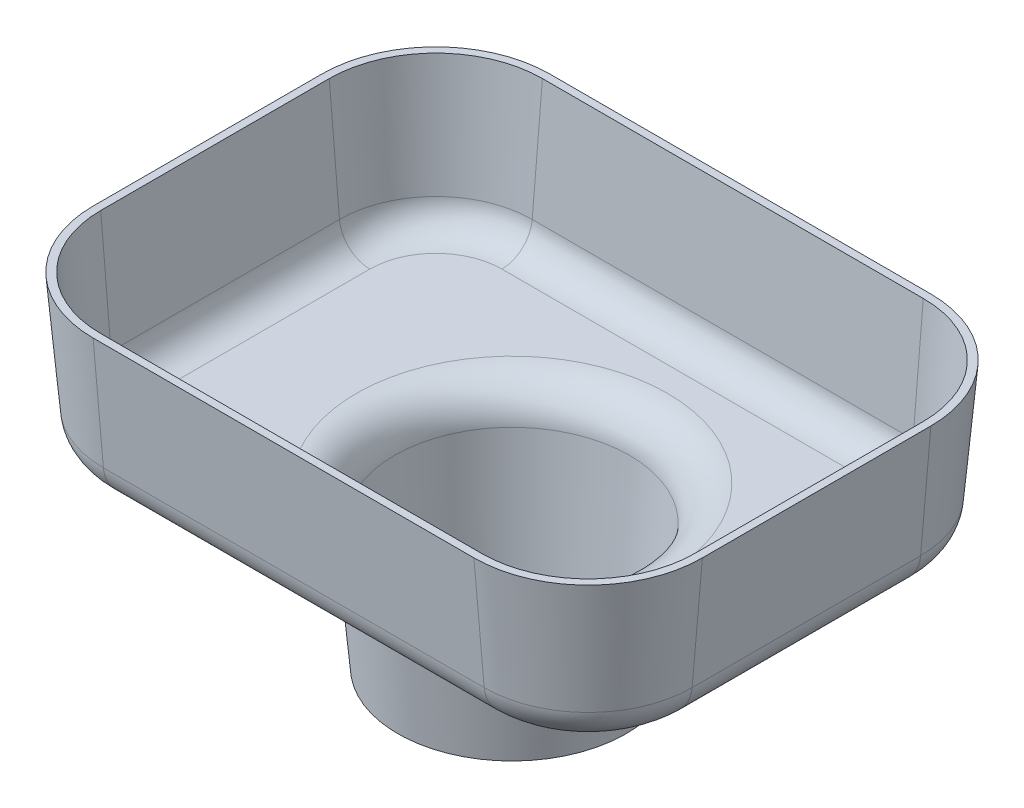
ISO-10303-21;
HEADER;
FILE_DESCRIPTION(('STEP AP214'),'2;1');
FILE_NAME('part.step','',(''),(''),'','','');
FILE_SCHEMA(('AUTOMOTIVE_DESIGN { 1 0 10303 214 1 1 1 1 }'));
ENDSEC;
DATA;
#1=APPLICATION_CONTEXT('core data for automotive mechanical design processes');
#2=APPLICATION_PROTOCOL_DEFINITION('international standard','automotive_design',2000,#1);
#3=PRODUCT_CONTEXT('',#1,'mechanical');
#4=PRODUCT('Part','Part','',(#3));
#5=PRODUCT_RELATED_PRODUCT_CATEGORY('part','',(#4));
#6=PRODUCT_DEFINITION_FORMATION('','',#4);
#7=PRODUCT_DEFINITION_CONTEXT('part definition',#1,'design');
#8=PRODUCT_DEFINITION('design','',#6,#7);
#9=PRODUCT_DEFINITION_SHAPE('','',#8);
#10=(LENGTH_UNIT() NAMED_UNIT(*) SI_UNIT(.MILLI.,.METRE.));
#11=(NAMED_UNIT(*) PLANE_ANGLE_UNIT() SI_UNIT($,.RADIAN.));
#12=(NAMED_UNIT(*) SI_UNIT($,.STERADIAN.) SOLID_ANGLE_UNIT());
#13=UNCERTAINTY_MEASURE_WITH_UNIT(LENGTH_MEASURE(1.E-05),#10,'distance_accuracy_value','');
#14=(GEOMETRIC_REPRESENTATION_CONTEXT(3) GLOBAL_UNCERTAINTY_ASSIGNED_CONTEXT((#13)) GLOBAL_UNIT_ASSIGNED_CONTEXT((#10,
#11,#12)) REPRESENTATION_CONTEXT('',''));
#15=CARTESIAN_POINT('',(0.,0.,0.));
#16=DIRECTION('',(0.,0.,1.));
#17=DIRECTION('',(1.,0.,0.));
#18=AXIS2_PLACEMENT_3D('',#15,#16,#17);
#19=CARTESIAN_POINT('',(-31.75,0.,-19.05));
#20=DIRECTION('',(0.,-1.,0.));
#21=DIRECTION('',(0.,0.,-1.));
#22=AXIS2_PLACEMENT_3D('',#19,#20,#21);
#23=PLANE('',#22);
#24=CARTESIAN_POINT('',(-31.75,0.,-19.05));
#25=DIRECTION('',(0.,1.,0.));
#26=DIRECTION('',(0.,0.,-1.));
#27=AXIS2_PLACEMENT_3D('',#24,#25,#26);
#28=CIRCLE('',#27,19.05);
#29=CARTESIAN_POINT('',(-31.7499999999999,0.,-38.1));
#30=VERTEX_POINT('',#29);
#31=CARTESIAN_POINT('',(-50.8,0.,-19.0499999999999));
#32=VERTEX_POINT('',#31);
#33=EDGE_CURVE('E341',#30,#32,#28,.T.);
#34=ORIENTED_EDGE('',*,*,#33,.T.);
#35=DIRECTION('',(0.,0.,1.));
#36=VECTOR('',#35,1.);
#37=CARTESIAN_POINT('',(-50.8,0.,19.0499999999999));
#38=LINE('',#37,#36);
#39=CARTESIAN_POINT('',(-50.8,0.,19.0499999999999));
#40=VERTEX_POINT('',#39);
#41=EDGE_CURVE('E345',#32,#40,#38,.T.);
#42=ORIENTED_EDGE('',*,*,#41,.T.);
#43=CARTESIAN_POINT('',(-31.75,0.,19.05));
#44=DIRECTION('',(0.,1.,0.));
#45=DIRECTION('',(0.,0.,1.));
#46=AXIS2_PLACEMENT_3D('',#43,#44,#45);
#47=CIRCLE('',#46,19.05);
#48=CARTESIAN_POINT('',(-31.75,0.,38.1));
#49=VERTEX_POINT('',#48);
#50=EDGE_CURVE('E349',#40,#49,#47,.T.);
#51=ORIENTED_EDGE('',*,*,#50,.T.);
#52=DIRECTION('',(1.,0.,0.));
#53=VECTOR('',#52,1.);
#54=CARTESIAN_POINT('',(31.7499999999999,0.,38.1));
#55=LINE('',#54,#53);
#56=CARTESIAN_POINT('',(31.7499999999999,0.,38.1));
#57=VERTEX_POINT('',#56);
#58=EDGE_CURVE('E353',#49,#57,#55,.T.);
#59=ORIENTED_EDGE('',*,*,#58,.T.);
#60=CARTESIAN_POINT('',(31.75,0.,19.05));
#61=DIRECTION('',(0.,1.,0.));
#62=DIRECTION('',(0.,0.,1.));
#63=AXIS2_PLACEMENT_3D('',#60,#61,#62);
#64=CIRCLE('',#63,19.05);
#65=CARTESIAN_POINT('',(50.8,0.,19.0499999999999));
#66=VERTEX_POINT('',#65);
#67=EDGE_CURVE('E357',#57,#66,#64,.T.);
#68=ORIENTED_EDGE('',*,*,#67,.T.);
#69=DIRECTION('',(0.,0.,-1.));
#70=VECTOR('',#69,1.);
#71=CARTESIAN_POINT('',(50.8,0.,19.0499999999999));
#72=LINE('',#71,#70);
#73=CARTESIAN_POINT('',(50.8,0.,-19.0499999999999));
#74=VERTEX_POINT('',#73);
#75=EDGE_CURVE('E361',#66,#74,#72,.T.);
#76=ORIENTED_EDGE('',*,*,#75,.T.);
#77=CARTESIAN_POINT('',(31.75,0.,-19.05));
#78=DIRECTION('',(0.,1.,0.));
#79=DIRECTION('',(0.,0.,1.));
#80=AXIS2_PLACEMENT_3D('',#77,#78,#79);
#81=CIRCLE('',#80,19.05);
#82=CARTESIAN_POINT('',(31.7499999999999,0.,-38.1));
#83=VERTEX_POINT('',#82);
#84=EDGE_CURVE('E365',#74,#83,#81,.T.);
#85=ORIENTED_EDGE('',*,*,#84,.T.);
#86=DIRECTION('',(-1.,0.,0.));
#87=VECTOR('',#86,1.);
#88=CARTESIAN_POINT('',(31.7499999999999,0.,-38.1));
#89=LINE('',#88,#87);
#90=EDGE_CURVE('E369',#83,#30,#89,.T.);
#91=ORIENTED_EDGE('',*,*,#90,.T.);
#92=EDGE_LOOP('',(#34,#42,#51,#59,#68,#76,#85,#91));
#93=FACE_BOUND('',#92,.T.);
#94=CARTESIAN_POINT('',(-31.75,0.,-19.05));
#95=DIRECTION('',(0.,-1.,0.));
#96=DIRECTION('',(0.,0.,-1.));
#97=AXIS2_PLACEMENT_3D('',#94,#95,#96);
#98=CIRCLE('',#97,17.77514880632);
#99=CARTESIAN_POINT('',(-31.7499999999999,0.,-36.8251488063199));
#100=VERTEX_POINT('',#99);
#101=CARTESIAN_POINT('',(-49.5251488063199,0.,-19.0499999999999));
#102=VERTEX_POINT('',#101);
#103=EDGE_CURVE('E226',#100,#102,#98,.F.);
#104=ORIENTED_EDGE('',*,*,#103,.F.);
#105=DIRECTION('',(-1.,0.,0.));
#106=VECTOR('',#105,1.);
#107=CARTESIAN_POINT('',(31.7499999999999,0.,-36.82514880632));
#108=LINE('',#107,#106);
#109=CARTESIAN_POINT('',(31.7499999999999,0.,-36.82514880632));
#110=VERTEX_POINT('',#109);
#111=EDGE_CURVE('E232',#110,#100,#108,.T.);
#112=ORIENTED_EDGE('',*,*,#111,.F.);
#113=CARTESIAN_POINT('',(31.75,0.,-19.05));
#114=DIRECTION('',(0.,-1.,0.));
#115=DIRECTION('',(0.,0.,-1.));
#116=AXIS2_PLACEMENT_3D('',#113,#114,#115);
#117=CIRCLE('',#116,17.77514880632);
#118=CARTESIAN_POINT('',(49.5251488063199,0.,-19.0499999999999));
#119=VERTEX_POINT('',#118);
#120=EDGE_CURVE('E61',#119,#110,#117,.F.);
#121=ORIENTED_EDGE('',*,*,#120,.F.);
#122=DIRECTION('',(0.,0.,-1.));
#123=VECTOR('',#122,1.);
#124=CARTESIAN_POINT('',(49.5251488063199,0.,19.0499999999999));
#125=LINE('',#124,#123);
#126=CARTESIAN_POINT('',(49.5251488063199,0.,19.0499999999999));
#127=VERTEX_POINT('',#126);
#128=EDGE_CURVE('E325',#127,#119,#125,.T.);
#129=ORIENTED_EDGE('',*,*,#128,.F.);
#130=CARTESIAN_POINT('',(31.75,0.,19.05));
#131=DIRECTION('',(0.,-1.,0.));
#132=DIRECTION('',(0.,0.,-1.));
#133=AXIS2_PLACEMENT_3D('',#130,#131,#132);
#134=CIRCLE('',#133,17.77514880632);
#135=CARTESIAN_POINT('',(31.7499999999999,0.,36.82514880632));
#136=VERTEX_POINT('',#135);
#137=EDGE_CURVE('E321',#136,#127,#134,.F.);
#138=ORIENTED_EDGE('',*,*,#137,.F.);
#139=DIRECTION('',(1.,0.,0.));
#140=VECTOR('',#139,1.);
#141=CARTESIAN_POINT('',(31.7499999999999,0.,36.82514880632));
#142=LINE('',#141,#140);
#143=CARTESIAN_POINT('',(-31.75,0.,36.82514880632));
#144=VERTEX_POINT('',#143);
#145=EDGE_CURVE('E317',#144,#136,#142,.T.);
#146=ORIENTED_EDGE('',*,*,#145,.F.);
#147=CARTESIAN_POINT('',(-31.75,0.,19.05));
#148=DIRECTION('',(0.,-1.,0.));
#149=DIRECTION('',(0.,0.,-1.));
#150=AXIS2_PLACEMENT_3D('',#147,#148,#149);
#151=CIRCLE('',#150,17.77514880632);
#152=CARTESIAN_POINT('',(-49.5251488063199,0.,19.0499999999999));
#153=VERTEX_POINT('',#152);
#154=EDGE_CURVE('E313',#153,#144,#151,.F.);
#155=ORIENTED_EDGE('',*,*,#154,.F.);
#156=DIRECTION('',(0.,0.,1.));
#157=VECTOR('',#156,1.);
#158=CARTESIAN_POINT('',(-49.5251488063199,0.,19.0499999999999));
#159=LINE('',#158,#157);
#160=EDGE_CURVE('E310',#102,#153,#159,.T.);
#161=ORIENTED_EDGE('',*,*,#160,.F.);
#162=EDGE_LOOP('',(#104,#112,#121,#129,#138,#146,#155,#161));
#163=FACE_BOUND('',#162,.T.);
#164=ADVANCED_FACE('F43',(#93,#163),#23,.F.);
#165=CARTESIAN_POINT('',(-31.75,0.,-19.05));
#166=DIRECTION('',(0.,1.,0.));
#167=DIRECTION('',(0.,0.,-1.));
#168=AXIS2_PLACEMENT_3D('',#165,#166,#167);
#169=CONICAL_SURFACE('',#168,19.05,0.0872664625997167);
#170=DIRECTION('',(0.,0.996194698091745,-0.0871557427476584));
#171=VECTOR('',#170,1.);
#172=CARTESIAN_POINT('',(-31.7499999999999,0.,-38.1));
#173=LINE('',#172,#171);
#174=CARTESIAN_POINT('',(-31.7499999999999,-19.6034389664476,-36.3849213243135));
#175=VERTEX_POINT('',#174);
#176=EDGE_CURVE('E374',#175,#30,#173,.T.);
#177=ORIENTED_EDGE('',*,*,#176,.F.);
#178=CARTESIAN_POINT('',(-31.75,-19.6034389664476,-19.05));
#179=DIRECTION('',(0.,-1.,0.));
#180=DIRECTION('',(0.,0.,-1.));
#181=AXIS2_PLACEMENT_3D('',#178,#179,#180);
#182=CIRCLE('',#181,17.3349213243135);
#183=CARTESIAN_POINT('',(-49.0849213243135,-19.6034389664476,-19.0499999999999));
#184=VERTEX_POINT('',#183);
#185=EDGE_CURVE('E446',#175,#184,#182,.F.);
#186=ORIENTED_EDGE('',*,*,#185,.T.);
#187=DIRECTION('',(-0.0871557427476584,0.996194698091745,0.));
#188=VECTOR('',#187,1.);
#189=CARTESIAN_POINT('',(-50.8,0.,-19.0499999999999));
#190=LINE('',#189,#188);
#191=EDGE_CURVE('E373',#184,#32,#190,.T.);
#192=ORIENTED_EDGE('',*,*,#191,.T.);
#193=ORIENTED_EDGE('',*,*,#33,.F.);
#194=EDGE_LOOP('',(#177,#186,#192,#193));
#195=FACE_BOUND('',#194,.T.);
#196=ADVANCED_FACE('F532',(#195),#169,.T.);
#197=CARTESIAN_POINT('',(31.7499999999999,0.,-38.1));
#198=DIRECTION('',(0.,-0.0871557427476584,-0.996194698091746));
#199=DIRECTION('',(0.,0.996194698091746,-0.0871557427476584));
#200=AXIS2_PLACEMENT_3D('',#197,#198,#199);
#201=PLANE('',#200);
#202=DIRECTION('',(0.,0.996194698091745,-0.0871557427476584));
#203=VECTOR('',#202,1.);
#204=CARTESIAN_POINT('',(31.7499999999999,0.,-38.1));
#205=LINE('',#204,#203);
#206=CARTESIAN_POINT('',(31.7499999999999,-19.6034389664476,-36.3849213243135));
#207=VERTEX_POINT('',#206);
#208=EDGE_CURVE('E378',#207,#83,#205,.T.);
#209=ORIENTED_EDGE('',*,*,#208,.F.);
#210=DIRECTION('',(-1.,0.,0.));
#211=VECTOR('',#210,1.);
#212=CARTESIAN_POINT('',(31.7499999999999,-19.6034389664476,-36.3849213243135));
#213=LINE('',#212,#211);
#214=EDGE_CURVE('E53',#207,#175,#213,.T.);
#215=ORIENTED_EDGE('',*,*,#214,.T.);
#216=ORIENTED_EDGE('',*,*,#176,.T.);
#217=ORIENTED_EDGE('',*,*,#90,.F.);
#218=EDGE_LOOP('',(#209,#215,#216,#217));
#219=FACE_BOUND('',#218,.T.);
#220=ADVANCED_FACE('F559',(#219),#201,.T.);
#221=CARTESIAN_POINT('',(31.75,0.,-19.05));
#222=DIRECTION('',(0.,1.,0.));
#223=DIRECTION('',(0.,0.,1.));
#224=AXIS2_PLACEMENT_3D('',#221,#222,#223);
#225=CONICAL_SURFACE('',#224,19.05,0.0872664625997167);
#226=DIRECTION('',(0.0871557427476584,0.996194698091745,0.));
#227=VECTOR('',#226,1.);
#228=CARTESIAN_POINT('',(50.8,0.,-19.0499999999999));
#229=LINE('',#228,#227);
#230=CARTESIAN_POINT('',(49.0849213243135,-19.6034389664476,-19.0499999999999));
#231=VERTEX_POINT('',#230);
#232=EDGE_CURVE('E393',#231,#74,#229,.T.);
#233=ORIENTED_EDGE('',*,*,#232,.F.);
#234=CARTESIAN_POINT('',(31.75,-19.6034389664476,-19.05));
#235=DIRECTION('',(0.,-1.,0.));
#236=DIRECTION('',(0.,0.,-1.));
#237=AXIS2_PLACEMENT_3D('',#234,#235,#236);
#238=CIRCLE('',#237,17.3349213243135);
#239=EDGE_CURVE('E11',#231,#207,#238,.F.);
#240=ORIENTED_EDGE('',*,*,#239,.T.);
#241=ORIENTED_EDGE('',*,*,#208,.T.);
#242=ORIENTED_EDGE('',*,*,#84,.F.);
#243=EDGE_LOOP('',(#233,#240,#241,#242));
#244=FACE_BOUND('',#243,.T.);
#245=ADVANCED_FACE('F574',(#244),#225,.T.);
#246=CARTESIAN_POINT('',(50.8,0.,19.0499999999999));
#247=DIRECTION('',(0.996194698091746,-0.0871557427476584,0.));
#248=DIRECTION('',(0.0871557427476584,0.996194698091746,0.));
#249=AXIS2_PLACEMENT_3D('',#246,#247,#248);
#250=PLANE('',#249);
#251=DIRECTION('',(0.0871557427476584,0.996194698091745,0.));
#252=VECTOR('',#251,1.);
#253=CARTESIAN_POINT('',(50.8,0.,19.0499999999999));
#254=LINE('',#253,#252);
#255=CARTESIAN_POINT('',(49.0849213243135,-19.6034389664476,19.0499999999999));
#256=VERTEX_POINT('',#255);
#257=EDGE_CURVE('E390',#256,#66,#254,.T.);
#258=ORIENTED_EDGE('',*,*,#257,.F.);
#259=DIRECTION('',(0.,0.,-1.));
#260=VECTOR('',#259,1.);
#261=CARTESIAN_POINT('',(49.0849213243135,-19.6034389664476,19.0499999999999));
#262=LINE('',#261,#260);
#263=EDGE_CURVE('E405',#256,#231,#262,.T.);
#264=ORIENTED_EDGE('',*,*,#263,.T.);
#265=ORIENTED_EDGE('',*,*,#232,.T.);
#266=ORIENTED_EDGE('',*,*,#75,.F.);
#267=EDGE_LOOP('',(#258,#264,#265,#266));
#268=FACE_BOUND('',#267,.T.);
#269=ADVANCED_FACE('F513',(#268),#250,.T.);
#270=CARTESIAN_POINT('',(31.75,0.,19.05));
#271=DIRECTION('',(0.,1.,0.));
#272=DIRECTION('',(0.,0.,1.));
#273=AXIS2_PLACEMENT_3D('',#270,#271,#272);
#274=CONICAL_SURFACE('',#273,19.05,0.0872664625997167);
#275=DIRECTION('',(0.,0.996194698091745,0.0871557427476584));
#276=VECTOR('',#275,1.);
#277=CARTESIAN_POINT('',(31.7499999999999,0.,38.1));
#278=LINE('',#277,#276);
#279=CARTESIAN_POINT('',(31.7499999999999,-19.6034389664476,36.3849213243135));
#280=VERTEX_POINT('',#279);
#281=EDGE_CURVE('E387',#280,#57,#278,.T.);
#282=ORIENTED_EDGE('',*,*,#281,.F.);
#283=CARTESIAN_POINT('',(31.75,-19.6034389664476,19.05));
#284=DIRECTION('',(0.,-1.,0.));
#285=DIRECTION('',(0.,0.,-1.));
#286=AXIS2_PLACEMENT_3D('',#283,#284,#285);
#287=CIRCLE('',#286,17.3349213243135);
#288=EDGE_CURVE('E434',#280,#256,#287,.F.);
#289=ORIENTED_EDGE('',*,*,#288,.T.);
#290=ORIENTED_EDGE('',*,*,#257,.T.);
#291=ORIENTED_EDGE('',*,*,#67,.F.);
#292=EDGE_LOOP('',(#282,#289,#290,#291));
#293=FACE_BOUND('',#292,.T.);
#294=ADVANCED_FACE('F509',(#293),#274,.T.);
#295=CARTESIAN_POINT('',(31.7499999999999,0.,38.1));
#296=DIRECTION('',(0.,-0.0871557427476584,0.996194698091746));
#297=DIRECTION('',(0.,-0.996194698091746,-0.0871557427476584));
#298=AXIS2_PLACEMENT_3D('',#295,#296,#297);
#299=PLANE('',#298);
#300=DIRECTION('',(0.,0.996194698091745,0.0871557427476584));
#301=VECTOR('',#300,1.);
#302=CARTESIAN_POINT('',(-31.75,0.,38.1));
#303=LINE('',#302,#301);
#304=CARTESIAN_POINT('',(-31.75,-19.6034389664476,36.3849213243135));
#305=VERTEX_POINT('',#304);
#306=EDGE_CURVE('E384',#305,#49,#303,.T.);
#307=ORIENTED_EDGE('',*,*,#306,.F.);
#308=DIRECTION('',(1.,0.,0.));
#309=VECTOR('',#308,1.);
#310=CARTESIAN_POINT('',(31.7499999999999,-19.6034389664476,36.3849213243135));
#311=LINE('',#310,#309);
#312=EDGE_CURVE('E437',#305,#280,#311,.T.);
#313=ORIENTED_EDGE('',*,*,#312,.T.);
#314=ORIENTED_EDGE('',*,*,#281,.T.);
#315=ORIENTED_EDGE('',*,*,#58,.F.);
#316=EDGE_LOOP('',(#307,#313,#314,#315));
#317=FACE_BOUND('',#316,.T.);
#318=ADVANCED_FACE('F521',(#317),#299,.T.);
#319=CARTESIAN_POINT('',(-31.75,0.,19.05));
#320=DIRECTION('',(0.,1.,0.));
#321=DIRECTION('',(0.,0.,1.));
#322=AXIS2_PLACEMENT_3D('',#319,#320,#321);
#323=CONICAL_SURFACE('',#322,19.05,0.0872664625997167);
#324=DIRECTION('',(-0.0871557427476584,0.996194698091745,0.));
#325=VECTOR('',#324,1.);
#326=CARTESIAN_POINT('',(-50.8,0.,19.0499999999999));
#327=LINE('',#326,#325);
#328=CARTESIAN_POINT('',(-49.0849213243135,-19.6034389664476,19.0499999999999));
#329=VERTEX_POINT('',#328);
#330=EDGE_CURVE('E381',#329,#40,#327,.T.);
#331=ORIENTED_EDGE('',*,*,#330,.F.);
#332=CARTESIAN_POINT('',(-31.75,-19.6034389664476,19.05));
#333=DIRECTION('',(0.,-1.,0.));
#334=DIRECTION('',(0.,0.,-1.));
#335=AXIS2_PLACEMENT_3D('',#332,#333,#334);
#336=CIRCLE('',#335,17.3349213243135);
#337=EDGE_CURVE('E440',#329,#305,#336,.F.);
#338=ORIENTED_EDGE('',*,*,#337,.T.);
#339=ORIENTED_EDGE('',*,*,#306,.T.);
#340=ORIENTED_EDGE('',*,*,#50,.F.);
#341=EDGE_LOOP('',(#331,#338,#339,#340));
#342=FACE_BOUND('',#341,.T.);
#343=ADVANCED_FACE('F524',(#342),#323,.T.);
#344=CARTESIAN_POINT('',(-50.8,0.,19.0499999999999));
#345=DIRECTION('',(-0.996194698091746,-0.0871557427476584,0.));
#346=DIRECTION('',(0.0871557427476584,-0.996194698091746,0.));
#347=AXIS2_PLACEMENT_3D('',#344,#345,#346);
#348=PLANE('',#347);
#349=ORIENTED_EDGE('',*,*,#191,.F.);
#350=DIRECTION('',(0.,0.,1.));
#351=VECTOR('',#350,1.);
#352=CARTESIAN_POINT('',(-49.0849213243135,-19.6034389664476,19.0499999999999));
#353=LINE('',#352,#351);
#354=EDGE_CURVE('E443',#184,#329,#353,.T.);
#355=ORIENTED_EDGE('',*,*,#354,.T.);
#356=ORIENTED_EDGE('',*,*,#330,.T.);
#357=ORIENTED_EDGE('',*,*,#41,.F.);
#358=EDGE_LOOP('',(#349,#355,#356,#357));
#359=FACE_BOUND('',#358,.T.);
#360=ADVANCED_FACE('F528',(#359),#348,.T.);
#361=CARTESIAN_POINT('',(-31.75,-25.4,-19.05));
#362=DIRECTION('',(0.,-1.,0.));
#363=DIRECTION('',(0.,0.,-1.));
#364=AXIS2_PLACEMENT_3D('',#361,#362,#363);
#365=PLANE('',#364);
#366=CARTESIAN_POINT('',(31.75,-25.4,-19.05));
#367=DIRECTION('',(0.,-1.,0.));
#368=DIRECTION('',(0.,0.,-1.));
#369=AXIS2_PLACEMENT_3D('',#366,#367,#368);
#370=CIRCLE('',#369,11.0090849914309);
#371=CARTESIAN_POINT('',(31.7499999999999,-25.4,-30.0590849914309));
#372=VERTEX_POINT('',#371);
#373=CARTESIAN_POINT('',(42.7590849914309,-25.4,-19.0499999999999));
#374=VERTEX_POINT('',#373);
#375=EDGE_CURVE('E409',#372,#374,#370,.T.);
#376=ORIENTED_EDGE('',*,*,#375,.T.);
#377=DIRECTION('',(0.,0.,-1.));
#378=VECTOR('',#377,1.);
#379=CARTESIAN_POINT('',(42.7590849914309,-25.4,-19.05));
#380=LINE('',#379,#378);
#381=CARTESIAN_POINT('',(42.7590849914309,-25.4,19.0499999999999));
#382=VERTEX_POINT('',#381);
#383=EDGE_CURVE('E430',#374,#382,#380,.F.);
#384=ORIENTED_EDGE('',*,*,#383,.T.);
#385=CARTESIAN_POINT('',(31.75,-25.4,19.05));
#386=DIRECTION('',(0.,-1.,0.));
#387=DIRECTION('',(0.,0.,-1.));
#388=AXIS2_PLACEMENT_3D('',#385,#386,#387);
#389=CIRCLE('',#388,11.0090849914309);
#390=CARTESIAN_POINT('',(31.7499999999999,-25.4,30.0590849914309));
#391=VERTEX_POINT('',#390);
#392=EDGE_CURVE('E427',#382,#391,#389,.T.);
#393=ORIENTED_EDGE('',*,*,#392,.T.);
#394=DIRECTION('',(1.,0.,0.));
#395=VECTOR('',#394,1.);
#396=CARTESIAN_POINT('',(-31.75,-25.4,30.0590849914309));
#397=LINE('',#396,#395);
#398=CARTESIAN_POINT('',(-31.75,-25.4,30.0590849914309));
#399=VERTEX_POINT('',#398);
#400=EDGE_CURVE('E424',#391,#399,#397,.F.);
#401=ORIENTED_EDGE('',*,*,#400,.T.);
#402=CARTESIAN_POINT('',(-31.75,-25.4,19.05));
#403=DIRECTION('',(0.,-1.,0.));
#404=DIRECTION('',(0.,0.,-1.));
#405=AXIS2_PLACEMENT_3D('',#402,#403,#404);
#406=CIRCLE('',#405,11.0090849914309);
#407=CARTESIAN_POINT('',(-42.7590849914309,-25.4,19.0499999999999));
#408=VERTEX_POINT('',#407);
#409=EDGE_CURVE('E421',#399,#408,#406,.T.);
#410=ORIENTED_EDGE('',*,*,#409,.T.);
#411=DIRECTION('',(0.,0.,1.));
#412=VECTOR('',#411,1.);
#413=CARTESIAN_POINT('',(-42.7590849914309,-25.4,-19.05));
#414=LINE('',#413,#412);
#415=CARTESIAN_POINT('',(-42.7590849914309,-25.4,-19.0499999999999));
#416=VERTEX_POINT('',#415);
#417=EDGE_CURVE('E418',#408,#416,#414,.F.);
#418=ORIENTED_EDGE('',*,*,#417,.T.);
#419=CARTESIAN_POINT('',(-31.75,-25.4,-19.05));
#420=DIRECTION('',(0.,-1.,0.));
#421=DIRECTION('',(0.,0.,-1.));
#422=AXIS2_PLACEMENT_3D('',#419,#420,#421);
#423=CIRCLE('',#422,11.0090849914309);
#424=CARTESIAN_POINT('',(-31.7499999999999,-25.4,-30.0590849914309));
#425=VERTEX_POINT('',#424);
#426=EDGE_CURVE('E415',#416,#425,#423,.T.);
#427=ORIENTED_EDGE('',*,*,#426,.T.);
#428=DIRECTION('',(-1.,0.,0.));
#429=VECTOR('',#428,1.);
#430=CARTESIAN_POINT('',(-31.75,-25.4,-30.0590849914309));
#431=LINE('',#430,#429);
#432=EDGE_CURVE('E412',#425,#372,#431,.F.);
#433=ORIENTED_EDGE('',*,*,#432,.T.);
#434=EDGE_LOOP('',(#376,#384,#393,#401,#410,#418,#427,#433));
#435=FACE_BOUND('',#434,.T.);
#436=CARTESIAN_POINT('',(0.,-25.4,0.));
#437=DIRECTION('',(0.,-1.,0.));
#438=DIRECTION('',(0.,0.,-1.));
#439=AXIS2_PLACEMENT_3D('',#436,#437,#438);
#440=CIRCLE('',#439,25.927174417567);
#441=CARTESIAN_POINT('',(0.,-25.4,-25.927174417567));
#442=VERTEX_POINT('',#441);
#443=EDGE_CURVE('E377',#442,#442,#440,.F.);
#444=ORIENTED_EDGE('',*,*,#443,.T.);
#445=EDGE_LOOP('',(#444));
#446=FACE_BOUND('',#445,.T.);
#447=ADVANCED_FACE('F492',(#435,#446),#365,.T.);
#448=CARTESIAN_POINT('',(0.,-50.8,0.));
#449=DIRECTION('',(0.,1.,0.));
#450=DIRECTION('',(0.,0.,-1.));
#451=AXIS2_PLACEMENT_3D('',#448,#449,#450);
#452=CONICAL_SURFACE('',#451,19.05,0.0872664625997167);
#453=CARTESIAN_POINT('',(0.,-30.0372488268419,0.));
#454=DIRECTION('',(0.,1.,0.));
#455=DIRECTION('',(0.,0.,1.));
#456=AXIS2_PLACEMENT_3D('',#453,#454,#455);
#457=CIRCLE('',#456,20.8665053512609);
#458=CARTESIAN_POINT('',(0.,-30.0372488268419,20.8665053512609));
#459=VERTEX_POINT('',#458);
#460=EDGE_CURVE('E401',#459,#459,#457,.F.);
#461=ORIENTED_EDGE('',*,*,#460,.T.);
#462=EDGE_LOOP('',(#461));
#463=FACE_BOUND('',#462,.T.);
#464=CARTESIAN_POINT('',(0.,-50.8,0.));
#465=DIRECTION('',(0.,-1.,0.));
#466=DIRECTION('',(0.,0.,-1.));
#467=AXIS2_PLACEMENT_3D('',#464,#465,#466);
#468=CIRCLE('',#467,19.05);
#469=CARTESIAN_POINT('',(0.,-50.8,-19.05));
#470=VERTEX_POINT('',#469);
#471=EDGE_CURVE('E337',#470,#470,#468,.T.);
#472=ORIENTED_EDGE('',*,*,#471,.F.);
#473=EDGE_LOOP('',(#472));
#474=FACE_BOUND('',#473,.T.);
#475=ADVANCED_FACE('F588',(#463,#474),#452,.T.);
#476=CARTESIAN_POINT('',(0.,-50.8,0.));
#477=DIRECTION('',(0.,-1.,0.));
#478=DIRECTION('',(0.,0.,-1.));
#479=AXIS2_PLACEMENT_3D('',#476,#477,#478);
#480=PLANE('',#479);
#481=CARTESIAN_POINT('',(0.,-50.8,0.));
#482=DIRECTION('',(0.,-1.,0.));
#483=DIRECTION('',(0.,0.,-1.));
#484=AXIS2_PLACEMENT_3D('',#481,#482,#483);
#485=CIRCLE('',#484,17.77514880632);
#486=CARTESIAN_POINT('',(0.,-50.8,-17.77514880632));
#487=VERTEX_POINT('',#486);
#488=EDGE_CURVE('E251',#487,#487,#485,.T.);
#489=ORIENTED_EDGE('',*,*,#488,.F.);
#490=EDGE_LOOP('',(#489));
#491=FACE_BOUND('',#490,.T.);
#492=ORIENTED_EDGE('',*,*,#471,.T.);
#493=EDGE_LOOP('',(#492));
#494=FACE_BOUND('',#493,.T.);
#495=ADVANCED_FACE('F582',(#491,#494),#480,.T.);
#496=CARTESIAN_POINT('',(0.,-30.48,0.));
#497=DIRECTION('',(0.,-1.,0.));
#498=DIRECTION('',(0.,0.,-1.));
#499=AXIS2_PLACEMENT_3D('',#496,#497,#498);
#500=TOROIDAL_SURFACE('',#499,25.927174417567,5.08);
#501=ORIENTED_EDGE('',*,*,#460,.F.);
#502=EDGE_LOOP('',(#501));
#503=FACE_BOUND('',#502,.T.);
#504=ORIENTED_EDGE('',*,*,#443,.F.);
#505=EDGE_LOOP('',(#504));
#506=FACE_BOUND('',#505,.T.);
#507=ADVANCED_FACE('F580',(#503,#506),#500,.F.);
#508=CARTESIAN_POINT('',(-42.7590849914309,-19.05,19.0499999999999));
#509=DIRECTION('',(0.,0.,1.));
#510=DIRECTION('',(1.,0.,0.));
#511=AXIS2_PLACEMENT_3D('',#508,#509,#510);
#512=CYLINDRICAL_SURFACE('',#511,6.35);
#513=CARTESIAN_POINT('',(-42.7590849914309,-19.05,-19.0499999999999));
#514=DIRECTION('',(0.,0.,-1.));
#515=DIRECTION('',(-1.,0.,0.));
#516=AXIS2_PLACEMENT_3D('',#513,#514,#515);
#517=CIRCLE('',#516,6.35);
#518=EDGE_CURVE('E473',#416,#184,#517,.T.);
#519=ORIENTED_EDGE('',*,*,#518,.F.);
#520=ORIENTED_EDGE('',*,*,#417,.F.);
#521=CARTESIAN_POINT('',(-42.7590849914309,-19.05,19.0499999999999));
#522=DIRECTION('',(0.,0.,1.));
#523=DIRECTION('',(0.,-1.,0.));
#524=AXIS2_PLACEMENT_3D('',#521,#522,#523);
#525=CIRCLE('',#524,6.35);
#526=EDGE_CURVE('E47',#329,#408,#525,.T.);
#527=ORIENTED_EDGE('',*,*,#526,.F.);
#528=ORIENTED_EDGE('',*,*,#354,.F.);
#529=EDGE_LOOP('',(#519,#520,#527,#528));
#530=FACE_BOUND('',#529,.T.);
#531=ADVANCED_FACE('F45',(#530),#512,.T.);
#532=CARTESIAN_POINT('',(-31.75,-19.05,19.05));
#533=DIRECTION('',(0.,-1.,0.));
#534=DIRECTION('',(0.,0.,-1.));
#535=AXIS2_PLACEMENT_3D('',#532,#533,#534);
#536=TOROIDAL_SURFACE('',#535,11.0090849914309,6.35);
#537=ORIENTED_EDGE('',*,*,#526,.T.);
#538=ORIENTED_EDGE('',*,*,#409,.F.);
#539=CARTESIAN_POINT('',(-31.75,-19.05,30.0590849914309));
#540=DIRECTION('',(1.,0.,0.));
#541=DIRECTION('',(0.,0.,-1.));
#542=AXIS2_PLACEMENT_3D('',#539,#540,#541);
#543=CIRCLE('',#542,6.35);
#544=EDGE_CURVE('E470',#305,#399,#543,.T.);
#545=ORIENTED_EDGE('',*,*,#544,.F.);
#546=ORIENTED_EDGE('',*,*,#337,.F.);
#547=EDGE_LOOP('',(#537,#538,#545,#546));
#548=FACE_BOUND('',#547,.T.);
#549=ADVANCED_FACE('F486',(#548),#536,.T.);
#550=CARTESIAN_POINT('',(-31.75,-19.05,-19.05));
#551=DIRECTION('',(0.,-1.,0.));
#552=DIRECTION('',(0.,0.,-1.));
#553=AXIS2_PLACEMENT_3D('',#550,#551,#552);
#554=TOROIDAL_SURFACE('',#553,11.0090849914309,6.35);
#555=ORIENTED_EDGE('',*,*,#518,.T.);
#556=ORIENTED_EDGE('',*,*,#185,.F.);
#557=CARTESIAN_POINT('',(-31.7499999999999,-19.05,-30.0590849914309));
#558=DIRECTION('',(1.,0.,0.));
#559=DIRECTION('',(0.,0.,-1.));
#560=AXIS2_PLACEMENT_3D('',#557,#558,#559);
#561=CIRCLE('',#560,6.35);
#562=EDGE_CURVE('E466',#425,#175,#561,.T.);
#563=ORIENTED_EDGE('',*,*,#562,.F.);
#564=ORIENTED_EDGE('',*,*,#426,.F.);
#565=EDGE_LOOP('',(#555,#556,#563,#564));
#566=FACE_BOUND('',#565,.T.);
#567=ADVANCED_FACE('F533',(#566),#554,.T.);
#568=CARTESIAN_POINT('',(31.7499999999999,-19.05,30.0590849914309));
#569=DIRECTION('',(1.,0.,0.));
#570=DIRECTION('',(0.,0.,-1.));
#571=AXIS2_PLACEMENT_3D('',#568,#569,#570);
#572=CYLINDRICAL_SURFACE('',#571,6.35);
#573=ORIENTED_EDGE('',*,*,#544,.T.);
#574=ORIENTED_EDGE('',*,*,#400,.F.);
#575=CARTESIAN_POINT('',(31.7499999999999,-19.05,30.0590849914309));
#576=DIRECTION('',(1.,0.,0.));
#577=DIRECTION('',(0.,1.,0.));
#578=AXIS2_PLACEMENT_3D('',#575,#576,#577);
#579=CIRCLE('',#578,6.35);
#580=EDGE_CURVE('E462',#280,#391,#579,.T.);
#581=ORIENTED_EDGE('',*,*,#580,.F.);
#582=ORIENTED_EDGE('',*,*,#312,.F.);
#583=EDGE_LOOP('',(#573,#574,#581,#582));
#584=FACE_BOUND('',#583,.T.);
#585=ADVANCED_FACE('F499',(#584),#572,.T.);
#586=CARTESIAN_POINT('',(31.7499999999999,-19.05,-30.0590849914309));
#587=DIRECTION('',(-1.,0.,0.));
#588=DIRECTION('',(0.,0.,1.));
#589=AXIS2_PLACEMENT_3D('',#586,#587,#588);
#590=CYLINDRICAL_SURFACE('',#589,6.35);
#591=ORIENTED_EDGE('',*,*,#562,.T.);
#592=ORIENTED_EDGE('',*,*,#214,.F.);
#593=CARTESIAN_POINT('',(31.7499999999999,-19.05,-30.0590849914309));
#594=DIRECTION('',(1.,0.,0.));
#595=DIRECTION('',(0.,0.,-1.));
#596=AXIS2_PLACEMENT_3D('',#593,#594,#595);
#597=CIRCLE('',#596,6.35);
#598=EDGE_CURVE('E458',#372,#207,#597,.T.);
#599=ORIENTED_EDGE('',*,*,#598,.F.);
#600=ORIENTED_EDGE('',*,*,#432,.F.);
#601=EDGE_LOOP('',(#591,#592,#599,#600));
#602=FACE_BOUND('',#601,.T.);
#603=ADVANCED_FACE('F537',(#602),#590,.T.);
#604=CARTESIAN_POINT('',(31.75,-19.05,19.05));
#605=DIRECTION('',(0.,-1.,0.));
#606=DIRECTION('',(0.,0.,-1.));
#607=AXIS2_PLACEMENT_3D('',#604,#605,#606);
#608=TOROIDAL_SURFACE('',#607,11.0090849914309,6.35);
#609=ORIENTED_EDGE('',*,*,#580,.T.);
#610=ORIENTED_EDGE('',*,*,#392,.F.);
#611=CARTESIAN_POINT('',(42.7590849914309,-19.05,19.0499999999999));
#612=DIRECTION('',(0.,0.,-1.));
#613=DIRECTION('',(0.,1.,0.));
#614=AXIS2_PLACEMENT_3D('',#611,#612,#613);
#615=CIRCLE('',#614,6.35);
#616=EDGE_CURVE('E454',#256,#382,#615,.T.);
#617=ORIENTED_EDGE('',*,*,#616,.F.);
#618=ORIENTED_EDGE('',*,*,#288,.F.);
#619=EDGE_LOOP('',(#609,#610,#617,#618));
#620=FACE_BOUND('',#619,.T.);
#621=ADVANCED_FACE('F503',(#620),#608,.T.);
#622=CARTESIAN_POINT('',(31.75,-19.05,-19.05));
#623=DIRECTION('',(0.,-1.,0.));
#624=DIRECTION('',(0.,0.,-1.));
#625=AXIS2_PLACEMENT_3D('',#622,#623,#624);
#626=TOROIDAL_SURFACE('',#625,11.0090849914309,6.35);
#627=ORIENTED_EDGE('',*,*,#598,.T.);
#628=ORIENTED_EDGE('',*,*,#239,.F.);
#629=CARTESIAN_POINT('',(42.7590849914309,-19.05,-19.0499999999999));
#630=DIRECTION('',(0.,0.,1.));
#631=DIRECTION('',(1.,0.,0.));
#632=AXIS2_PLACEMENT_3D('',#629,#630,#631);
#633=CIRCLE('',#632,6.35);
#634=EDGE_CURVE('E451',#374,#231,#633,.T.);
#635=ORIENTED_EDGE('',*,*,#634,.F.);
#636=ORIENTED_EDGE('',*,*,#375,.F.);
#637=EDGE_LOOP('',(#627,#628,#635,#636));
#638=FACE_BOUND('',#637,.T.);
#639=ADVANCED_FACE('F545',(#638),#626,.T.);
#640=CARTESIAN_POINT('',(42.7590849914309,-19.05,19.0499999999999));
#641=DIRECTION('',(0.,0.,-1.));
#642=DIRECTION('',(-1.,0.,0.));
#643=AXIS2_PLACEMENT_3D('',#640,#641,#642);
#644=CYLINDRICAL_SURFACE('',#643,6.35);
#645=ORIENTED_EDGE('',*,*,#616,.T.);
#646=ORIENTED_EDGE('',*,*,#383,.F.);
#647=ORIENTED_EDGE('',*,*,#634,.T.);
#648=ORIENTED_EDGE('',*,*,#263,.F.);
#649=EDGE_LOOP('',(#645,#646,#647,#648));
#650=FACE_BOUND('',#649,.T.);
#651=ADVANCED_FACE('F544',(#650),#644,.T.);
#652=CARTESIAN_POINT('',(-31.75,0.110687793289526,-19.05));
#653=DIRECTION('',(0.,1.,0.));
#654=DIRECTION('',(0.,0.,-1.));
#655=AXIS2_PLACEMENT_3D('',#652,#653,#654);
#656=CONICAL_SURFACE('',#655,17.7848327334235,0.0872664625997167);
#657=DIRECTION('',(0.,0.996194698091746,-0.0871557427476584));
#658=VECTOR('',#657,1.);
#659=CARTESIAN_POINT('',(-31.7499999999999,0.110687793289527,-36.8348327334235));
#660=LINE('',#659,#658);
#661=CARTESIAN_POINT('',(-31.7499999999999,-19.4927511731581,-35.1197540577369));
#662=VERTEX_POINT('',#661);
#663=EDGE_CURVE('E288',#662,#100,#660,.T.);
#664=ORIENTED_EDGE('',*,*,#663,.T.);
#665=ORIENTED_EDGE('',*,*,#103,.T.);
#666=DIRECTION('',(-0.0871557427476584,0.996194698091746,0.));
#667=VECTOR('',#666,1.);
#668=CARTESIAN_POINT('',(-49.5348327334235,0.110687793289526,-19.0499999999999));
#669=LINE('',#668,#667);
#670=CARTESIAN_POINT('',(-47.819754057737,-19.4927511731581,-19.0499999999999));
#671=VERTEX_POINT('',#670);
#672=EDGE_CURVE('E222',#671,#102,#669,.T.);
#673=ORIENTED_EDGE('',*,*,#672,.F.);
#674=CARTESIAN_POINT('',(-31.75,-19.4927511731581,-19.05));
#675=DIRECTION('',(0.,1.,0.));
#676=DIRECTION('',(0.,0.,1.));
#677=AXIS2_PLACEMENT_3D('',#674,#675,#676);
#678=CIRCLE('',#677,16.069754057737);
#679=EDGE_CURVE('E208',#662,#671,#678,.T.);
#680=ORIENTED_EDGE('',*,*,#679,.F.);
#681=EDGE_LOOP('',(#664,#665,#673,#680));
#682=FACE_BOUND('',#681,.T.);
#683=ADVANCED_FACE('F224',(#682),#656,.F.);
#684=CARTESIAN_POINT('',(31.7499999999999,0.110687793289526,-36.8348327334235));
#685=DIRECTION('',(0.,-0.0871557427476584,-0.996194698091746));
#686=DIRECTION('',(0.,0.996194698091746,-0.0871557427476584));
#687=AXIS2_PLACEMENT_3D('',#684,#685,#686);
#688=PLANE('',#687);
#689=DIRECTION('',(0.,0.996194698091746,-0.0871557427476584));
#690=VECTOR('',#689,1.);
#691=CARTESIAN_POINT('',(31.7499999999999,0.110687793289526,-36.8348327334235));
#692=LINE('',#691,#690);
#693=CARTESIAN_POINT('',(31.7499999999999,-19.4927511731581,-35.119754057737));
#694=VERTEX_POINT('',#693);
#695=EDGE_CURVE('E987',#694,#110,#692,.T.);
#696=ORIENTED_EDGE('',*,*,#695,.T.);
#697=ORIENTED_EDGE('',*,*,#111,.T.);
#698=ORIENTED_EDGE('',*,*,#663,.F.);
#699=DIRECTION('',(1.,0.,0.));
#700=VECTOR('',#699,1.);
#701=CARTESIAN_POINT('',(31.7499999999999,-19.4927511731581,-35.119754057737));
#702=LINE('',#701,#700);
#703=EDGE_CURVE('E218',#694,#662,#702,.F.);
#704=ORIENTED_EDGE('',*,*,#703,.F.);
#705=EDGE_LOOP('',(#696,#697,#698,#704));
#706=FACE_BOUND('',#705,.T.);
#707=ADVANCED_FACE('F664',(#706),#688,.F.);
#708=CARTESIAN_POINT('',(31.75,0.110687793289526,-19.05));
#709=DIRECTION('',(0.,1.,0.));
#710=DIRECTION('',(0.,0.,1.));
#711=AXIS2_PLACEMENT_3D('',#708,#709,#710);
#712=CONICAL_SURFACE('',#711,17.7848327334235,0.0872664625997167);
#713=DIRECTION('',(0.0871557427476584,0.996194698091746,0.));
#714=VECTOR('',#713,1.);
#715=CARTESIAN_POINT('',(49.5348327334235,0.110687793289526,-19.0499999999999));
#716=LINE('',#715,#714);
#717=CARTESIAN_POINT('',(47.819754057737,-19.4927511731581,-19.0499999999999));
#718=VERTEX_POINT('',#717);
#719=EDGE_CURVE('E992',#718,#119,#716,.T.);
#720=ORIENTED_EDGE('',*,*,#719,.T.);
#721=ORIENTED_EDGE('',*,*,#120,.T.);
#722=ORIENTED_EDGE('',*,*,#695,.F.);
#723=CARTESIAN_POINT('',(31.75,-19.4927511731581,-19.05));
#724=DIRECTION('',(0.,1.,0.));
#725=DIRECTION('',(0.,0.,1.));
#726=AXIS2_PLACEMENT_3D('',#723,#724,#725);
#727=CIRCLE('',#726,16.069754057737);
#728=EDGE_CURVE('E455',#718,#694,#727,.T.);
#729=ORIENTED_EDGE('',*,*,#728,.F.);
#730=EDGE_LOOP('',(#720,#721,#722,#729));
#731=FACE_BOUND('',#730,.T.);
#732=ADVANCED_FACE('F660',(#731),#712,.F.);
#733=CARTESIAN_POINT('',(49.5348327334235,0.110687793289526,19.0499999999999));
#734=DIRECTION('',(0.996194698091746,-0.0871557427476584,0.));
#735=DIRECTION('',(0.0871557427476584,0.996194698091746,0.));
#736=AXIS2_PLACEMENT_3D('',#733,#734,#735);
#737=PLANE('',#736);
#738=DIRECTION('',(0.0871557427476584,0.996194698091746,0.));
#739=VECTOR('',#738,1.);
#740=CARTESIAN_POINT('',(49.5348327334235,0.110687793289526,19.0499999999999));
#741=LINE('',#740,#739);
#742=CARTESIAN_POINT('',(47.819754057737,-19.4927511731581,19.0499999999999));
#743=VERTEX_POINT('',#742);
#744=EDGE_CURVE('E1021',#743,#127,#741,.T.);
#745=ORIENTED_EDGE('',*,*,#744,.T.);
#746=ORIENTED_EDGE('',*,*,#128,.T.);
#747=ORIENTED_EDGE('',*,*,#719,.F.);
#748=DIRECTION('',(0.,0.,1.));
#749=VECTOR('',#748,1.);
#750=CARTESIAN_POINT('',(47.819754057737,-19.4927511731581,19.0499999999999));
#751=LINE('',#750,#749);
#752=EDGE_CURVE('E265',#743,#718,#751,.F.);
#753=ORIENTED_EDGE('',*,*,#752,.F.);
#754=EDGE_LOOP('',(#745,#746,#747,#753));
#755=FACE_BOUND('',#754,.T.);
#756=ADVANCED_FACE('F656',(#755),#737,.F.);
#757=CARTESIAN_POINT('',(31.75,0.110687793289526,19.05));
#758=DIRECTION('',(0.,1.,0.));
#759=DIRECTION('',(0.,0.,1.));
#760=AXIS2_PLACEMENT_3D('',#757,#758,#759);
#761=CONICAL_SURFACE('',#760,17.7848327334235,0.0872664625997167);
#762=DIRECTION('',(0.,-0.996194698091746,-0.0871557427476584));
#763=VECTOR('',#762,1.);
#764=CARTESIAN_POINT('',(31.7499999999999,0.110687793289526,36.8348327334235));
#765=LINE('',#764,#763);
#766=CARTESIAN_POINT('',(31.7499999999999,-19.4927511731581,35.119754057737));
#767=VERTEX_POINT('',#766);
#768=EDGE_CURVE('E1005',#767,#136,#765,.F.);
#769=ORIENTED_EDGE('',*,*,#768,.T.);
#770=ORIENTED_EDGE('',*,*,#137,.T.);
#771=ORIENTED_EDGE('',*,*,#744,.F.);
#772=CARTESIAN_POINT('',(31.75,-19.4927511731581,19.05));
#773=DIRECTION('',(0.,1.,0.));
#774=DIRECTION('',(0.,0.,1.));
#775=AXIS2_PLACEMENT_3D('',#772,#773,#774);
#776=CIRCLE('',#775,16.069754057737);
#777=EDGE_CURVE('E270',#767,#743,#776,.T.);
#778=ORIENTED_EDGE('',*,*,#777,.F.);
#779=EDGE_LOOP('',(#769,#770,#771,#778));
#780=FACE_BOUND('',#779,.T.);
#781=ADVANCED_FACE('F652',(#780),#761,.F.);
#782=CARTESIAN_POINT('',(31.7499999999999,0.110687793289526,36.8348327334235));
#783=DIRECTION('',(0.,-0.0871557427476584,0.996194698091746));
#784=DIRECTION('',(0.,-0.996194698091746,-0.0871557427476584));
#785=AXIS2_PLACEMENT_3D('',#782,#783,#784);
#786=PLANE('',#785);
#787=DIRECTION('',(0.,0.996194698091746,0.0871557427476584));
#788=VECTOR('',#787,1.);
#789=CARTESIAN_POINT('',(-31.75,0.110687793289526,36.8348327334235));
#790=LINE('',#789,#788);
#791=CARTESIAN_POINT('',(-31.75,-19.4927511731581,35.119754057737));
#792=VERTEX_POINT('',#791);
#793=EDGE_CURVE('E1000',#792,#144,#790,.T.);
#794=ORIENTED_EDGE('',*,*,#793,.T.);
#795=ORIENTED_EDGE('',*,*,#145,.T.);
#796=ORIENTED_EDGE('',*,*,#768,.F.);
#797=DIRECTION('',(1.,0.,0.));
#798=VECTOR('',#797,1.);
#799=CARTESIAN_POINT('',(31.7499999999999,-19.4927511731581,35.119754057737));
#800=LINE('',#799,#798);
#801=EDGE_CURVE('E1008',#792,#767,#800,.T.);
#802=ORIENTED_EDGE('',*,*,#801,.F.);
#803=EDGE_LOOP('',(#794,#795,#796,#802));
#804=FACE_BOUND('',#803,.T.);
#805=ADVANCED_FACE('F648',(#804),#786,.F.);
#806=CARTESIAN_POINT('',(-31.75,0.110687793289526,19.05));
#807=DIRECTION('',(0.,1.,0.));
#808=DIRECTION('',(0.,0.,1.));
#809=AXIS2_PLACEMENT_3D('',#806,#807,#808);
#810=CONICAL_SURFACE('',#809,17.7848327334235,0.0872664625997167);
#811=DIRECTION('',(0.0871557427476584,-0.996194698091746,0.));
#812=VECTOR('',#811,1.);
#813=CARTESIAN_POINT('',(-49.5348327334235,0.110687793289526,19.0499999999999));
#814=LINE('',#813,#812);
#815=CARTESIAN_POINT('',(-47.819754057737,-19.4927511731581,19.0499999999999));
#816=VERTEX_POINT('',#815);
#817=EDGE_CURVE('E231',#816,#153,#814,.F.);
#818=ORIENTED_EDGE('',*,*,#817,.T.);
#819=ORIENTED_EDGE('',*,*,#154,.T.);
#820=ORIENTED_EDGE('',*,*,#793,.F.);
#821=CARTESIAN_POINT('',(-31.75,-19.4927511731581,19.05));
#822=DIRECTION('',(0.,1.,0.));
#823=DIRECTION('',(0.,0.,1.));
#824=AXIS2_PLACEMENT_3D('',#821,#822,#823);
#825=CIRCLE('',#824,16.069754057737);
#826=EDGE_CURVE('E240',#816,#792,#825,.T.);
#827=ORIENTED_EDGE('',*,*,#826,.F.);
#828=EDGE_LOOP('',(#818,#819,#820,#827));
#829=FACE_BOUND('',#828,.T.);
#830=ADVANCED_FACE('F645',(#829),#810,.F.);
#831=CARTESIAN_POINT('',(-49.5348327334235,0.110687793289526,19.0499999999999));
#832=DIRECTION('',(-0.996194698091746,-0.0871557427476584,0.));
#833=DIRECTION('',(0.0871557427476584,-0.996194698091746,0.));
#834=AXIS2_PLACEMENT_3D('',#831,#832,#833);
#835=PLANE('',#834);
#836=ORIENTED_EDGE('',*,*,#672,.T.);
#837=ORIENTED_EDGE('',*,*,#160,.T.);
#838=ORIENTED_EDGE('',*,*,#817,.F.);
#839=DIRECTION('',(0.,0.,1.));
#840=VECTOR('',#839,1.);
#841=CARTESIAN_POINT('',(-47.819754057737,-19.4927511731581,19.0499999999999));
#842=LINE('',#841,#840);
#843=EDGE_CURVE('E219',#671,#816,#842,.T.);
#844=ORIENTED_EDGE('',*,*,#843,.F.);
#845=EDGE_LOOP('',(#836,#837,#838,#844));
#846=FACE_BOUND('',#845,.T.);
#847=ADVANCED_FACE('F235',(#846),#835,.F.);
#848=CARTESIAN_POINT('',(-31.75,-24.13,-19.05));
#849=DIRECTION('',(0.,-1.,0.));
#850=DIRECTION('',(0.,0.,-1.));
#851=AXIS2_PLACEMENT_3D('',#848,#849,#850);
#852=PLANE('',#851);
#853=CARTESIAN_POINT('',(31.75,-24.13,-19.05));
#854=DIRECTION('',(0.,-1.,0.));
#855=DIRECTION('',(0.,0.,-1.));
#856=AXIS2_PLACEMENT_3D('',#853,#854,#855);
#857=CIRCLE('',#856,11.0090849914309);
#858=CARTESIAN_POINT('',(31.7499999999999,-24.13,-30.0590849914309));
#859=VERTEX_POINT('',#858);
#860=CARTESIAN_POINT('',(42.7590849914309,-24.13,-19.0499999999999));
#861=VERTEX_POINT('',#860);
#862=EDGE_CURVE('E261',#859,#861,#857,.T.);
#863=ORIENTED_EDGE('',*,*,#862,.F.);
#864=DIRECTION('',(1.,0.,0.));
#865=VECTOR('',#864,1.);
#866=CARTESIAN_POINT('',(-31.75,-24.13,-30.0590849914309));
#867=LINE('',#866,#865);
#868=CARTESIAN_POINT('',(-31.7499999999999,-24.13,-30.0590849914309));
#869=VERTEX_POINT('',#868);
#870=EDGE_CURVE('E264',#869,#859,#867,.T.);
#871=ORIENTED_EDGE('',*,*,#870,.F.);
#872=CARTESIAN_POINT('',(-31.75,-24.13,-19.05));
#873=DIRECTION('',(0.,-1.,0.));
#874=DIRECTION('',(0.,0.,-1.));
#875=AXIS2_PLACEMENT_3D('',#872,#873,#874);
#876=CIRCLE('',#875,11.0090849914309);
#877=CARTESIAN_POINT('',(-42.7590849914309,-24.13,-19.0499999999999));
#878=VERTEX_POINT('',#877);
#879=EDGE_CURVE('E259',#878,#869,#876,.T.);
#880=ORIENTED_EDGE('',*,*,#879,.F.);
#881=DIRECTION('',(0.,0.,-1.));
#882=VECTOR('',#881,1.);
#883=CARTESIAN_POINT('',(-42.7590849914309,-24.13,-19.05));
#884=LINE('',#883,#882);
#885=CARTESIAN_POINT('',(-42.7590849914309,-24.13,19.0499999999999));
#886=VERTEX_POINT('',#885);
#887=EDGE_CURVE('E244',#886,#878,#884,.T.);
#888=ORIENTED_EDGE('',*,*,#887,.F.);
#889=CARTESIAN_POINT('',(-31.75,-24.13,19.05));
#890=DIRECTION('',(0.,-1.,0.));
#891=DIRECTION('',(0.,0.,-1.));
#892=AXIS2_PLACEMENT_3D('',#889,#890,#891);
#893=CIRCLE('',#892,11.0090849914309);
#894=CARTESIAN_POINT('',(-31.75,-24.13,30.0590849914309));
#895=VERTEX_POINT('',#894);
#896=EDGE_CURVE('E258',#895,#886,#893,.T.);
#897=ORIENTED_EDGE('',*,*,#896,.F.);
#898=DIRECTION('',(1.,0.,0.));
#899=VECTOR('',#898,1.);
#900=CARTESIAN_POINT('',(-31.75,-24.13,30.0590849914309));
#901=LINE('',#900,#899);
#902=CARTESIAN_POINT('',(31.7499999999999,-24.13,30.0590849914309));
#903=VERTEX_POINT('',#902);
#904=EDGE_CURVE('E274',#903,#895,#901,.F.);
#905=ORIENTED_EDGE('',*,*,#904,.F.);
#906=CARTESIAN_POINT('',(31.75,-24.13,19.05));
#907=DIRECTION('',(0.,-1.,0.));
#908=DIRECTION('',(0.,0.,-1.));
#909=AXIS2_PLACEMENT_3D('',#906,#907,#908);
#910=CIRCLE('',#909,11.0090849914309);
#911=CARTESIAN_POINT('',(42.7590849914309,-24.13,19.0499999999999));
#912=VERTEX_POINT('',#911);
#913=EDGE_CURVE('E271',#912,#903,#910,.T.);
#914=ORIENTED_EDGE('',*,*,#913,.F.);
#915=DIRECTION('',(0.,0.,-1.));
#916=VECTOR('',#915,1.);
#917=CARTESIAN_POINT('',(42.7590849914309,-24.13,-19.05));
#918=LINE('',#917,#916);
#919=EDGE_CURVE('E266',#861,#912,#918,.F.);
#920=ORIENTED_EDGE('',*,*,#919,.F.);
#921=EDGE_LOOP('',(#863,#871,#880,#888,#897,#905,#914,#920));
#922=FACE_BOUND('',#921,.T.);
#923=CARTESIAN_POINT('',(0.,-24.13,0.));
#924=DIRECTION('',(0.,-1.,0.));
#925=DIRECTION('',(0.,0.,-1.));
#926=AXIS2_PLACEMENT_3D('',#923,#924,#925);
#927=CIRCLE('',#926,25.927174417567);
#928=CARTESIAN_POINT('',(0.,-24.13,-25.927174417567));
#929=VERTEX_POINT('',#928);
#930=EDGE_CURVE('E283',#929,#929,#927,.F.);
#931=ORIENTED_EDGE('',*,*,#930,.F.);
#932=EDGE_LOOP('',(#931));
#933=FACE_BOUND('',#932,.T.);
#934=ADVANCED_FACE('F638',(#922,#933),#852,.F.);
#935=CARTESIAN_POINT('',(0.,-50.6893122067105,0.));
#936=DIRECTION('',(0.,1.,0.));
#937=DIRECTION('',(0.,0.,-1.));
#938=AXIS2_PLACEMENT_3D('',#935,#936,#937);
#939=CONICAL_SURFACE('',#938,17.7848327334235,0.0872664625997167);
#940=CARTESIAN_POINT('',(0.,-29.9265610335524,0.));
#941=DIRECTION('',(0.,1.,0.));
#942=DIRECTION('',(0.,0.,1.));
#943=AXIS2_PLACEMENT_3D('',#940,#941,#942);
#944=CIRCLE('',#943,19.6013380846844);
#945=CARTESIAN_POINT('',(0.,-29.9265610335524,19.6013380846844));
#946=VERTEX_POINT('',#945);
#947=EDGE_CURVE('E287',#946,#946,#944,.F.);
#948=ORIENTED_EDGE('',*,*,#947,.F.);
#949=EDGE_LOOP('',(#948));
#950=FACE_BOUND('',#949,.T.);
#951=ORIENTED_EDGE('',*,*,#488,.T.);
#952=EDGE_LOOP('',(#951));
#953=FACE_BOUND('',#952,.T.);
#954=ADVANCED_FACE('F634',(#950,#953),#939,.F.);
#955=CARTESIAN_POINT('',(0.,-30.48,0.));
#956=DIRECTION('',(0.,-1.,0.));
#957=DIRECTION('',(0.,0.,-1.));
#958=AXIS2_PLACEMENT_3D('',#955,#956,#957);
#959=TOROIDAL_SURFACE('',#958,25.927174417567,6.35);
#960=ORIENTED_EDGE('',*,*,#947,.T.);
#961=EDGE_LOOP('',(#960));
#962=FACE_BOUND('',#961,.T.);
#963=ORIENTED_EDGE('',*,*,#930,.T.);
#964=EDGE_LOOP('',(#963));
#965=FACE_BOUND('',#964,.T.);
#966=ADVANCED_FACE('F631',(#962,#965),#959,.T.);
#967=CARTESIAN_POINT('',(-42.7590849914309,-19.05,19.0499999999999));
#968=DIRECTION('',(0.,0.,1.));
#969=DIRECTION('',(1.,0.,0.));
#970=AXIS2_PLACEMENT_3D('',#967,#968,#969);
#971=CYLINDRICAL_SURFACE('',#970,5.08);
#972=CARTESIAN_POINT('',(-42.7590849914309,-19.05,-19.0499999999999));
#973=DIRECTION('',(0.,0.,1.));
#974=DIRECTION('',(1.,0.,0.));
#975=AXIS2_PLACEMENT_3D('',#972,#973,#974);
#976=CIRCLE('',#975,5.08);
#977=EDGE_CURVE('E212',#878,#671,#976,.F.);
#978=ORIENTED_EDGE('',*,*,#977,.T.);
#979=ORIENTED_EDGE('',*,*,#843,.T.);
#980=CARTESIAN_POINT('',(-42.7590849914309,-19.05,19.0499999999999));
#981=DIRECTION('',(0.,0.,1.));
#982=DIRECTION('',(1.,0.,0.));
#983=AXIS2_PLACEMENT_3D('',#980,#981,#982);
#984=CIRCLE('',#983,5.08);
#985=EDGE_CURVE('E246',#816,#886,#984,.T.);
#986=ORIENTED_EDGE('',*,*,#985,.T.);
#987=ORIENTED_EDGE('',*,*,#887,.T.);
#988=EDGE_LOOP('',(#978,#979,#986,#987));
#989=FACE_BOUND('',#988,.T.);
#990=ADVANCED_FACE('F242',(#989),#971,.F.);
#991=CARTESIAN_POINT('',(-31.75,-19.05,19.05));
#992=DIRECTION('',(0.,-1.,0.));
#993=DIRECTION('',(0.,0.,-1.));
#994=AXIS2_PLACEMENT_3D('',#991,#992,#993);
#995=TOROIDAL_SURFACE('',#994,11.0090849914309,5.08);
#996=ORIENTED_EDGE('',*,*,#985,.F.);
#997=ORIENTED_EDGE('',*,*,#826,.T.);
#998=CARTESIAN_POINT('',(-31.75,-19.05,30.0590849914309));
#999=DIRECTION('',(1.,0.,0.));
#1000=DIRECTION('',(0.,0.,-1.));
#1001=AXIS2_PLACEMENT_3D('',#998,#999,#1000);
#1002=CIRCLE('',#1001,5.08);
#1003=EDGE_CURVE('E247',#792,#895,#1002,.T.);
#1004=ORIENTED_EDGE('',*,*,#1003,.T.);
#1005=ORIENTED_EDGE('',*,*,#896,.T.);
#1006=EDGE_LOOP('',(#996,#997,#1004,#1005));
#1007=FACE_BOUND('',#1006,.T.);
#1008=ADVANCED_FACE('F625',(#1007),#995,.F.);
#1009=CARTESIAN_POINT('',(-31.75,-19.05,-19.05));
#1010=DIRECTION('',(0.,-1.,0.));
#1011=DIRECTION('',(0.,0.,-1.));
#1012=AXIS2_PLACEMENT_3D('',#1009,#1010,#1011);
#1013=TOROIDAL_SURFACE('',#1012,11.0090849914309,5.08);
#1014=ORIENTED_EDGE('',*,*,#977,.F.);
#1015=ORIENTED_EDGE('',*,*,#879,.T.);
#1016=CARTESIAN_POINT('',(-31.7499999999999,-19.05,-30.0590849914309));
#1017=DIRECTION('',(-1.,0.,0.));
#1018=DIRECTION('',(0.,0.,1.));
#1019=AXIS2_PLACEMENT_3D('',#1016,#1017,#1018);
#1020=CIRCLE('',#1019,5.08);
#1021=EDGE_CURVE('E215',#869,#662,#1020,.F.);
#1022=ORIENTED_EDGE('',*,*,#1021,.T.);
#1023=ORIENTED_EDGE('',*,*,#679,.T.);
#1024=EDGE_LOOP('',(#1014,#1015,#1022,#1023));
#1025=FACE_BOUND('',#1024,.T.);
#1026=ADVANCED_FACE('F210',(#1025),#1013,.F.);
#1027=CARTESIAN_POINT('',(31.7499999999999,-19.05,30.0590849914309));
#1028=DIRECTION('',(1.,0.,0.));
#1029=DIRECTION('',(0.,0.,-1.));
#1030=AXIS2_PLACEMENT_3D('',#1027,#1028,#1029);
#1031=CYLINDRICAL_SURFACE('',#1030,5.08);
#1032=ORIENTED_EDGE('',*,*,#1003,.F.);
#1033=ORIENTED_EDGE('',*,*,#801,.T.);
#1034=CARTESIAN_POINT('',(31.7499999999999,-19.05,30.0590849914309));
#1035=DIRECTION('',(1.,0.,0.));
#1036=DIRECTION('',(0.,0.,-1.));
#1037=AXIS2_PLACEMENT_3D('',#1034,#1035,#1036);
#1038=CIRCLE('',#1037,5.08);
#1039=EDGE_CURVE('E292',#767,#903,#1038,.T.);
#1040=ORIENTED_EDGE('',*,*,#1039,.T.);
#1041=ORIENTED_EDGE('',*,*,#904,.T.);
#1042=EDGE_LOOP('',(#1032,#1033,#1040,#1041));
#1043=FACE_BOUND('',#1042,.T.);
#1044=ADVANCED_FACE('F618',(#1043),#1031,.F.);
#1045=CARTESIAN_POINT('',(31.7499999999999,-19.05,-30.0590849914309));
#1046=DIRECTION('',(-1.,0.,0.));
#1047=DIRECTION('',(0.,0.,1.));
#1048=AXIS2_PLACEMENT_3D('',#1045,#1046,#1047);
#1049=CYLINDRICAL_SURFACE('',#1048,5.08);
#1050=ORIENTED_EDGE('',*,*,#1021,.F.);
#1051=ORIENTED_EDGE('',*,*,#870,.T.);
#1052=CARTESIAN_POINT('',(31.7499999999999,-19.05,-30.0590849914309));
#1053=DIRECTION('',(-1.,0.,0.));
#1054=DIRECTION('',(0.,0.,1.));
#1055=AXIS2_PLACEMENT_3D('',#1052,#1053,#1054);
#1056=CIRCLE('',#1055,5.08);
#1057=EDGE_CURVE('E296',#859,#694,#1056,.F.);
#1058=ORIENTED_EDGE('',*,*,#1057,.T.);
#1059=ORIENTED_EDGE('',*,*,#703,.T.);
#1060=EDGE_LOOP('',(#1050,#1051,#1058,#1059));
#1061=FACE_BOUND('',#1060,.T.);
#1062=ADVANCED_FACE('F614',(#1061),#1049,.F.);
#1063=CARTESIAN_POINT('',(31.75,-19.05,19.05));
#1064=DIRECTION('',(0.,-1.,0.));
#1065=DIRECTION('',(0.,0.,-1.));
#1066=AXIS2_PLACEMENT_3D('',#1063,#1064,#1065);
#1067=TOROIDAL_SURFACE('',#1066,11.0090849914309,5.08);
#1068=ORIENTED_EDGE('',*,*,#1039,.F.);
#1069=ORIENTED_EDGE('',*,*,#777,.T.);
#1070=CARTESIAN_POINT('',(42.7590849914309,-19.05,19.0499999999999));
#1071=DIRECTION('',(0.,0.,-1.));
#1072=DIRECTION('',(-1.,0.,0.));
#1073=AXIS2_PLACEMENT_3D('',#1070,#1071,#1072);
#1074=CIRCLE('',#1073,5.08);
#1075=EDGE_CURVE('E297',#743,#912,#1074,.T.);
#1076=ORIENTED_EDGE('',*,*,#1075,.T.);
#1077=ORIENTED_EDGE('',*,*,#913,.T.);
#1078=EDGE_LOOP('',(#1068,#1069,#1076,#1077));
#1079=FACE_BOUND('',#1078,.T.);
#1080=ADVANCED_FACE('F610',(#1079),#1067,.F.);
#1081=CARTESIAN_POINT('',(31.75,-19.05,-19.05));
#1082=DIRECTION('',(0.,-1.,0.));
#1083=DIRECTION('',(0.,0.,-1.));
#1084=AXIS2_PLACEMENT_3D('',#1081,#1082,#1083);
#1085=TOROIDAL_SURFACE('',#1084,11.0090849914309,5.08);
#1086=ORIENTED_EDGE('',*,*,#1057,.F.);
#1087=ORIENTED_EDGE('',*,*,#862,.T.);
#1088=CARTESIAN_POINT('',(42.7590849914309,-19.05,-19.0499999999999));
#1089=DIRECTION('',(0.,0.,-1.));
#1090=DIRECTION('',(-1.,0.,0.));
#1091=AXIS2_PLACEMENT_3D('',#1088,#1089,#1090);
#1092=CIRCLE('',#1091,5.08);
#1093=EDGE_CURVE('E300',#861,#718,#1092,.F.);
#1094=ORIENTED_EDGE('',*,*,#1093,.T.);
#1095=ORIENTED_EDGE('',*,*,#728,.T.);
#1096=EDGE_LOOP('',(#1086,#1087,#1094,#1095));
#1097=FACE_BOUND('',#1096,.T.);
#1098=ADVANCED_FACE('F606',(#1097),#1085,.F.);
#1099=CARTESIAN_POINT('',(42.7590849914309,-19.05,19.0499999999999));
#1100=DIRECTION('',(0.,0.,-1.));
#1101=DIRECTION('',(-1.,0.,0.));
#1102=AXIS2_PLACEMENT_3D('',#1099,#1100,#1101);
#1103=CYLINDRICAL_SURFACE('',#1102,5.08);
#1104=ORIENTED_EDGE('',*,*,#1075,.F.);
#1105=ORIENTED_EDGE('',*,*,#752,.T.);
#1106=ORIENTED_EDGE('',*,*,#1093,.F.);
#1107=ORIENTED_EDGE('',*,*,#919,.T.);
#1108=EDGE_LOOP('',(#1104,#1105,#1106,#1107));
#1109=FACE_BOUND('',#1108,.T.);
#1110=ADVANCED_FACE('F603',(#1109),#1103,.F.);
#1111=CLOSED_SHELL('',(#164,#196,#220,#245,#269,#294,#318,#343,#360,#447,#475,#495,#507,#531,
#549,#567,#585,#603,#621,#639,#651,#683,#707,#732,#756,#781,#805,#830,#847,#934,#954,#966,#990,
#1008,#1026,#1044,#1062,#1080,#1098,#1110));
#1112=MANIFOLD_SOLID_BREP('B2',#1111);
#1113=ADVANCED_BREP_SHAPE_REPRESENTATION('',(#18,#1112),#14);
#1114=SHAPE_DEFINITION_REPRESENTATION(#9,#1113);
ENDSEC;
END-ISO-10303-21;
